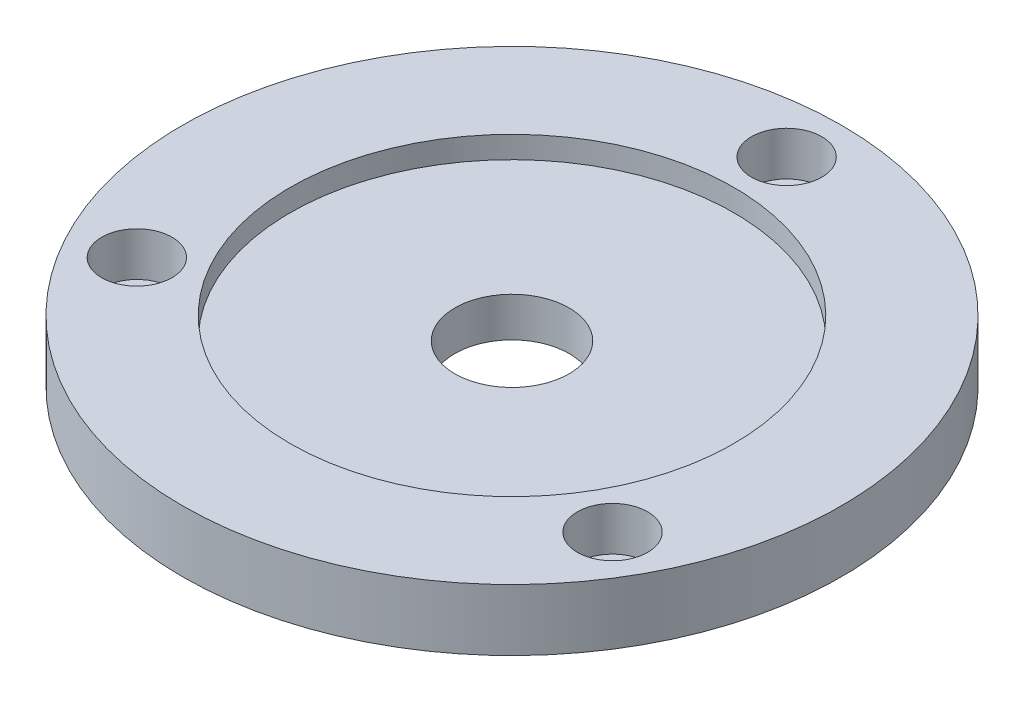
ISO-10303-21;
HEADER;
FILE_DESCRIPTION(('STEP AP214'),'2;1');
FILE_NAME('part.step','',(''),(''),'','','');
FILE_SCHEMA(('AUTOMOTIVE_DESIGN { 1 0 10303 214 1 1 1 1 }'));
ENDSEC;
DATA;
#1=APPLICATION_CONTEXT('core data for automotive mechanical design processes');
#2=APPLICATION_PROTOCOL_DEFINITION('international standard','automotive_design',2000,#1);
#3=PRODUCT_CONTEXT('',#1,'mechanical');
#4=PRODUCT('Part','Part','',(#3));
#5=PRODUCT_RELATED_PRODUCT_CATEGORY('part','',(#4));
#6=PRODUCT_DEFINITION_FORMATION('','',#4);
#7=PRODUCT_DEFINITION_CONTEXT('part definition',#1,'design');
#8=PRODUCT_DEFINITION('design','',#6,#7);
#9=PRODUCT_DEFINITION_SHAPE('','',#8);
#10=(LENGTH_UNIT() NAMED_UNIT(*) SI_UNIT(.MILLI.,.METRE.));
#11=(NAMED_UNIT(*) PLANE_ANGLE_UNIT() SI_UNIT($,.RADIAN.));
#12=(NAMED_UNIT(*) SI_UNIT($,.STERADIAN.) SOLID_ANGLE_UNIT());
#13=UNCERTAINTY_MEASURE_WITH_UNIT(LENGTH_MEASURE(1.E-05),#10,'distance_accuracy_value','');
#14=(GEOMETRIC_REPRESENTATION_CONTEXT(3) GLOBAL_UNCERTAINTY_ASSIGNED_CONTEXT((#13)) GLOBAL_UNIT_ASSIGNED_CONTEXT((#10,
#11,#12)) REPRESENTATION_CONTEXT('',''));
#15=CARTESIAN_POINT('',(0.,0.,0.));
#16=DIRECTION('',(0.,0.,1.));
#17=DIRECTION('',(1.,0.,0.));
#18=AXIS2_PLACEMENT_3D('',#15,#16,#17);
#19=CARTESIAN_POINT('',(54.1265877365273,0.,31.2500000000003));
#20=DIRECTION('',(0.,1.,0.));
#21=DIRECTION('',(0.,0.,1.));
#22=AXIS2_PLACEMENT_3D('',#19,#20,#21);
#23=CYLINDRICAL_SURFACE('',#22,5.);
#24=CARTESIAN_POINT('',(54.1265877365273,0.,31.2500000000003));
#25=DIRECTION('',(0.,1.,0.));
#26=DIRECTION('',(0.,0.,1.));
#27=AXIS2_PLACEMENT_3D('',#24,#25,#26);
#28=CIRCLE('',#27,5.);
#29=CARTESIAN_POINT('',(54.1265877365273,0.,36.2500000000003));
#30=VERTEX_POINT('',#29);
#31=EDGE_CURVE('E88',#30,#30,#28,.T.);
#32=ORIENTED_EDGE('',*,*,#31,.F.);
#33=EDGE_LOOP('',(#32));
#34=FACE_BOUND('',#33,.T.);
#35=CARTESIAN_POINT('',(54.1265877365273,4.,31.2500000000003));
#36=DIRECTION('',(0.,1.,0.));
#37=DIRECTION('',(0.,0.,1.));
#38=AXIS2_PLACEMENT_3D('',#35,#36,#37);
#39=CIRCLE('',#38,5.);
#40=CARTESIAN_POINT('',(54.1265877365273,4.,36.2500000000003));
#41=VERTEX_POINT('',#40);
#42=EDGE_CURVE('E36',#41,#41,#39,.F.);
#43=ORIENTED_EDGE('',*,*,#42,.F.);
#44=EDGE_LOOP('',(#43));
#45=FACE_BOUND('',#44,.T.);
#46=ADVANCED_FACE('F32',(#34,#45),#23,.F.);
#47=CARTESIAN_POINT('',(0.,0.,-62.5));
#48=DIRECTION('',(0.,1.,0.));
#49=DIRECTION('',(0.,0.,1.));
#50=AXIS2_PLACEMENT_3D('',#47,#48,#49);
#51=CYLINDRICAL_SURFACE('',#50,5.);
#52=CARTESIAN_POINT('',(0.,0.,-62.5));
#53=DIRECTION('',(0.,1.,0.));
#54=DIRECTION('',(0.,0.,1.));
#55=AXIS2_PLACEMENT_3D('',#52,#53,#54);
#56=CIRCLE('',#55,5.);
#57=CARTESIAN_POINT('',(0.,0.,-57.5));
#58=VERTEX_POINT('',#57);
#59=EDGE_CURVE('E45',#58,#58,#56,.T.);
#60=ORIENTED_EDGE('',*,*,#59,.F.);
#61=EDGE_LOOP('',(#60));
#62=FACE_BOUND('',#61,.T.);
#63=CARTESIAN_POINT('',(0.,4.,-62.5));
#64=DIRECTION('',(0.,1.,0.));
#65=DIRECTION('',(0.,0.,1.));
#66=AXIS2_PLACEMENT_3D('',#63,#64,#65);
#67=CIRCLE('',#66,5.);
#68=CARTESIAN_POINT('',(0.,4.,-57.5));
#69=VERTEX_POINT('',#68);
#70=EDGE_CURVE('E59',#69,#69,#67,.F.);
#71=ORIENTED_EDGE('',*,*,#70,.F.);
#72=EDGE_LOOP('',(#71));
#73=FACE_BOUND('',#72,.T.);
#74=ADVANCED_FACE('F98',(#62,#73),#51,.F.);
#75=CARTESIAN_POINT('',(-54.1265877365273,0.,31.2500000000003));
#76=DIRECTION('',(0.,1.,0.));
#77=DIRECTION('',(0.,0.,1.));
#78=AXIS2_PLACEMENT_3D('',#75,#76,#77);
#79=CYLINDRICAL_SURFACE('',#78,4.99999999999999);
#80=CARTESIAN_POINT('',(-54.1265877365273,0.,31.2500000000003));
#81=DIRECTION('',(0.,1.,0.));
#82=DIRECTION('',(0.,0.,1.));
#83=AXIS2_PLACEMENT_3D('',#80,#81,#82);
#84=CIRCLE('',#83,4.99999999999999);
#85=CARTESIAN_POINT('',(-54.1265877365273,0.,36.2500000000003));
#86=VERTEX_POINT('',#85);
#87=EDGE_CURVE('E86',#86,#86,#84,.T.);
#88=ORIENTED_EDGE('',*,*,#87,.F.);
#89=EDGE_LOOP('',(#88));
#90=FACE_BOUND('',#89,.T.);
#91=CARTESIAN_POINT('',(-54.1265877365273,4.,31.2500000000003));
#92=DIRECTION('',(0.,1.,0.));
#93=DIRECTION('',(0.,0.,1.));
#94=AXIS2_PLACEMENT_3D('',#91,#92,#93);
#95=CIRCLE('',#94,4.99999999999999);
#96=CARTESIAN_POINT('',(-54.1265877365273,4.,36.2500000000003));
#97=VERTEX_POINT('',#96);
#98=EDGE_CURVE('E55',#97,#97,#95,.F.);
#99=ORIENTED_EDGE('',*,*,#98,.F.);
#100=EDGE_LOOP('',(#99));
#101=FACE_BOUND('',#100,.T.);
#102=ADVANCED_FACE('F101',(#90,#101),#79,.F.);
#103=CARTESIAN_POINT('',(0.,0.,0.));
#104=DIRECTION('',(0.,1.,0.));
#105=DIRECTION('',(0.,0.,1.));
#106=AXIS2_PLACEMENT_3D('',#103,#104,#105);
#107=CYLINDRICAL_SURFACE('',#106,13.);
#108=CARTESIAN_POINT('',(0.,0.,0.));
#109=DIRECTION('',(0.,1.,0.));
#110=DIRECTION('',(0.,0.,1.));
#111=AXIS2_PLACEMENT_3D('',#108,#109,#110);
#112=CIRCLE('',#111,13.);
#113=CARTESIAN_POINT('',(0.,0.,13.));
#114=VERTEX_POINT('',#113);
#115=EDGE_CURVE('E53',#114,#114,#112,.T.);
#116=ORIENTED_EDGE('',*,*,#115,.F.);
#117=EDGE_LOOP('',(#116));
#118=FACE_BOUND('',#117,.T.);
#119=CARTESIAN_POINT('',(0.,9.,0.));
#120=DIRECTION('',(0.,1.,0.));
#121=DIRECTION('',(0.,0.,1.));
#122=AXIS2_PLACEMENT_3D('',#119,#120,#121);
#123=CIRCLE('',#122,13.);
#124=CARTESIAN_POINT('',(0.,9.,13.));
#125=VERTEX_POINT('',#124);
#126=EDGE_CURVE('E50',#125,#125,#123,.F.);
#127=ORIENTED_EDGE('',*,*,#126,.F.);
#128=EDGE_LOOP('',(#127));
#129=FACE_BOUND('',#128,.T.);
#130=ADVANCED_FACE('F107',(#118,#129),#107,.F.);
#131=CARTESIAN_POINT('',(0.,14.,0.));
#132=DIRECTION('',(0.,-1.,0.));
#133=DIRECTION('',(0.,0.,-1.));
#134=AXIS2_PLACEMENT_3D('',#131,#132,#133);
#135=CYLINDRICAL_SURFACE('',#134,75.);
#136=CARTESIAN_POINT('',(0.,14.,0.));
#137=DIRECTION('',(0.,1.,0.));
#138=DIRECTION('',(0.,0.,1.));
#139=AXIS2_PLACEMENT_3D('',#136,#137,#138);
#140=CIRCLE('',#139,75.);
#141=CARTESIAN_POINT('',(0.,14.,75.));
#142=VERTEX_POINT('',#141);
#143=EDGE_CURVE('E10',#142,#142,#140,.T.);
#144=ORIENTED_EDGE('',*,*,#143,.F.);
#145=EDGE_LOOP('',(#144));
#146=FACE_BOUND('',#145,.T.);
#147=CARTESIAN_POINT('',(0.,0.,0.));
#148=DIRECTION('',(0.,1.,0.));
#149=DIRECTION('',(0.,0.,1.));
#150=AXIS2_PLACEMENT_3D('',#147,#148,#149);
#151=CIRCLE('',#150,75.);
#152=CARTESIAN_POINT('',(0.,0.,75.));
#153=VERTEX_POINT('',#152);
#154=EDGE_CURVE('E40',#153,#153,#151,.T.);
#155=ORIENTED_EDGE('',*,*,#154,.T.);
#156=EDGE_LOOP('',(#155));
#157=FACE_BOUND('',#156,.T.);
#158=ADVANCED_FACE('F34',(#146,#157),#135,.T.);
#159=CARTESIAN_POINT('',(0.,14.,0.));
#160=DIRECTION('',(0.,1.,0.));
#161=DIRECTION('',(0.,0.,1.));
#162=AXIS2_PLACEMENT_3D('',#159,#160,#161);
#163=PLANE('',#162);
#164=CARTESIAN_POINT('',(54.1265877365273,14.,31.2500000000003));
#165=DIRECTION('',(0.,1.,0.));
#166=DIRECTION('',(0.,0.,1.));
#167=AXIS2_PLACEMENT_3D('',#164,#165,#166);
#168=CIRCLE('',#167,8.);
#169=CARTESIAN_POINT('',(54.1265877365273,14.,39.2500000000003));
#170=VERTEX_POINT('',#169);
#171=EDGE_CURVE('E75',#170,#170,#168,.T.);
#172=ORIENTED_EDGE('',*,*,#171,.F.);
#173=EDGE_LOOP('',(#172));
#174=FACE_BOUND('',#173,.T.);
#175=CARTESIAN_POINT('',(0.,14.,-62.5));
#176=DIRECTION('',(0.,1.,0.));
#177=DIRECTION('',(0.,0.,1.));
#178=AXIS2_PLACEMENT_3D('',#175,#176,#177);
#179=CIRCLE('',#178,8.);
#180=CARTESIAN_POINT('',(0.,14.,-54.5));
#181=VERTEX_POINT('',#180);
#182=EDGE_CURVE('E68',#181,#181,#179,.T.);
#183=ORIENTED_EDGE('',*,*,#182,.F.);
#184=EDGE_LOOP('',(#183));
#185=FACE_BOUND('',#184,.T.);
#186=CARTESIAN_POINT('',(-54.1265877365273,14.,31.2500000000003));
#187=DIRECTION('',(0.,1.,0.));
#188=DIRECTION('',(0.,0.,1.));
#189=AXIS2_PLACEMENT_3D('',#186,#187,#188);
#190=CIRCLE('',#189,8.);
#191=CARTESIAN_POINT('',(-54.1265877365273,14.,39.2500000000003));
#192=VERTEX_POINT('',#191);
#193=EDGE_CURVE('E61',#192,#192,#190,.T.);
#194=ORIENTED_EDGE('',*,*,#193,.F.);
#195=EDGE_LOOP('',(#194));
#196=FACE_BOUND('',#195,.T.);
#197=CARTESIAN_POINT('',(0.,14.,0.));
#198=DIRECTION('',(0.,1.,0.));
#199=DIRECTION('',(0.,0.,1.));
#200=AXIS2_PLACEMENT_3D('',#197,#198,#199);
#201=CIRCLE('',#200,50.5);
#202=CARTESIAN_POINT('',(0.,14.,50.5));
#203=VERTEX_POINT('',#202);
#204=EDGE_CURVE('E57',#203,#203,#201,.T.);
#205=ORIENTED_EDGE('',*,*,#204,.F.);
#206=EDGE_LOOP('',(#205));
#207=FACE_BOUND('',#206,.T.);
#208=ORIENTED_EDGE('',*,*,#143,.T.);
#209=EDGE_LOOP('',(#208));
#210=FACE_BOUND('',#209,.T.);
#211=ADVANCED_FACE('F113',(#174,#185,#196,#207,#210),#163,.T.);
#212=CARTESIAN_POINT('',(0.,0.,0.));
#213=DIRECTION('',(0.,1.,0.));
#214=DIRECTION('',(0.,0.,1.));
#215=AXIS2_PLACEMENT_3D('',#212,#213,#214);
#216=PLANE('',#215);
#217=ORIENTED_EDGE('',*,*,#115,.T.);
#218=EDGE_LOOP('',(#217));
#219=FACE_BOUND('',#218,.T.);
#220=ORIENTED_EDGE('',*,*,#87,.T.);
#221=EDGE_LOOP('',(#220));
#222=FACE_BOUND('',#221,.T.);
#223=ORIENTED_EDGE('',*,*,#31,.T.);
#224=EDGE_LOOP('',(#223));
#225=FACE_BOUND('',#224,.T.);
#226=ORIENTED_EDGE('',*,*,#59,.T.);
#227=EDGE_LOOP('',(#226));
#228=FACE_BOUND('',#227,.T.);
#229=ORIENTED_EDGE('',*,*,#154,.F.);
#230=EDGE_LOOP('',(#229));
#231=FACE_BOUND('',#230,.T.);
#232=ADVANCED_FACE('F95',(#219,#222,#225,#228,#231),#216,.F.);
#233=CARTESIAN_POINT('',(0.,9.,0.));
#234=DIRECTION('',(0.,1.,0.));
#235=DIRECTION('',(0.,0.,1.));
#236=AXIS2_PLACEMENT_3D('',#233,#234,#235);
#237=PLANE('',#236);
#238=CARTESIAN_POINT('',(0.,9.,0.));
#239=DIRECTION('',(0.,1.,0.));
#240=DIRECTION('',(0.,0.,1.));
#241=AXIS2_PLACEMENT_3D('',#238,#239,#240);
#242=CIRCLE('',#241,50.5);
#243=CARTESIAN_POINT('',(0.,9.,50.5));
#244=VERTEX_POINT('',#243);
#245=EDGE_CURVE('E54',#244,#244,#242,.T.);
#246=ORIENTED_EDGE('',*,*,#245,.T.);
#247=EDGE_LOOP('',(#246));
#248=FACE_BOUND('',#247,.T.);
#249=ORIENTED_EDGE('',*,*,#126,.T.);
#250=EDGE_LOOP('',(#249));
#251=FACE_BOUND('',#250,.T.);
#252=ADVANCED_FACE('F117',(#248,#251),#237,.T.);
#253=CARTESIAN_POINT('',(0.,9.,0.));
#254=DIRECTION('',(0.,1.,0.));
#255=DIRECTION('',(0.,0.,1.));
#256=AXIS2_PLACEMENT_3D('',#253,#254,#255);
#257=CYLINDRICAL_SURFACE('',#256,50.5);
#258=ORIENTED_EDGE('',*,*,#245,.F.);
#259=EDGE_LOOP('',(#258));
#260=FACE_BOUND('',#259,.T.);
#261=ORIENTED_EDGE('',*,*,#204,.T.);
#262=EDGE_LOOP('',(#261));
#263=FACE_BOUND('',#262,.T.);
#264=ADVANCED_FACE('F122',(#260,#263),#257,.F.);
#265=CARTESIAN_POINT('',(-54.1265877365273,4.,31.2500000000003));
#266=DIRECTION('',(0.,1.,0.));
#267=DIRECTION('',(0.,0.,1.));
#268=AXIS2_PLACEMENT_3D('',#265,#266,#267);
#269=PLANE('',#268);
#270=CARTESIAN_POINT('',(-54.1265877365273,4.,31.2500000000003));
#271=DIRECTION('',(0.,1.,0.));
#272=DIRECTION('',(0.,0.,1.));
#273=AXIS2_PLACEMENT_3D('',#270,#271,#272);
#274=CIRCLE('',#273,8.);
#275=CARTESIAN_POINT('',(-54.1265877365273,4.,39.2500000000003));
#276=VERTEX_POINT('',#275);
#277=EDGE_CURVE('E58',#276,#276,#274,.T.);
#278=ORIENTED_EDGE('',*,*,#277,.T.);
#279=EDGE_LOOP('',(#278));
#280=FACE_BOUND('',#279,.T.);
#281=ORIENTED_EDGE('',*,*,#98,.T.);
#282=EDGE_LOOP('',(#281));
#283=FACE_BOUND('',#282,.T.);
#284=ADVANCED_FACE('F131',(#280,#283),#269,.T.);
#285=CARTESIAN_POINT('',(-54.1265877365273,4.,31.2500000000003));
#286=DIRECTION('',(0.,1.,0.));
#287=DIRECTION('',(0.,0.,1.));
#288=AXIS2_PLACEMENT_3D('',#285,#286,#287);
#289=CYLINDRICAL_SURFACE('',#288,8.);
#290=ORIENTED_EDGE('',*,*,#277,.F.);
#291=EDGE_LOOP('',(#290));
#292=FACE_BOUND('',#291,.T.);
#293=ORIENTED_EDGE('',*,*,#193,.T.);
#294=EDGE_LOOP('',(#293));
#295=FACE_BOUND('',#294,.T.);
#296=ADVANCED_FACE('F133',(#292,#295),#289,.F.);
#297=CARTESIAN_POINT('',(0.,4.,-62.5));
#298=DIRECTION('',(0.,1.,0.));
#299=DIRECTION('',(0.,0.,1.));
#300=AXIS2_PLACEMENT_3D('',#297,#298,#299);
#301=PLANE('',#300);
#302=CARTESIAN_POINT('',(0.,4.,-62.5));
#303=DIRECTION('',(0.,1.,0.));
#304=DIRECTION('',(0.,0.,1.));
#305=AXIS2_PLACEMENT_3D('',#302,#303,#304);
#306=CIRCLE('',#305,8.);
#307=CARTESIAN_POINT('',(0.,4.,-54.5));
#308=VERTEX_POINT('',#307);
#309=EDGE_CURVE('E62',#308,#308,#306,.T.);
#310=ORIENTED_EDGE('',*,*,#309,.T.);
#311=EDGE_LOOP('',(#310));
#312=FACE_BOUND('',#311,.T.);
#313=ORIENTED_EDGE('',*,*,#70,.T.);
#314=EDGE_LOOP('',(#313));
#315=FACE_BOUND('',#314,.T.);
#316=ADVANCED_FACE('F140',(#312,#315),#301,.T.);
#317=CARTESIAN_POINT('',(0.,4.,-62.5));
#318=DIRECTION('',(0.,1.,0.));
#319=DIRECTION('',(0.,0.,1.));
#320=AXIS2_PLACEMENT_3D('',#317,#318,#319);
#321=CYLINDRICAL_SURFACE('',#320,8.);
#322=ORIENTED_EDGE('',*,*,#309,.F.);
#323=EDGE_LOOP('',(#322));
#324=FACE_BOUND('',#323,.T.);
#325=ORIENTED_EDGE('',*,*,#182,.T.);
#326=EDGE_LOOP('',(#325));
#327=FACE_BOUND('',#326,.T.);
#328=ADVANCED_FACE('F146',(#324,#327),#321,.F.);
#329=CARTESIAN_POINT('',(54.1265877365273,4.,31.2500000000003));
#330=DIRECTION('',(0.,1.,0.));
#331=DIRECTION('',(0.,0.,1.));
#332=AXIS2_PLACEMENT_3D('',#329,#330,#331);
#333=PLANE('',#332);
#334=CARTESIAN_POINT('',(54.1265877365273,4.,31.2500000000003));
#335=DIRECTION('',(0.,1.,0.));
#336=DIRECTION('',(0.,0.,1.));
#337=AXIS2_PLACEMENT_3D('',#334,#335,#336);
#338=CIRCLE('',#337,8.);
#339=CARTESIAN_POINT('',(54.1265877365273,4.,39.2500000000003));
#340=VERTEX_POINT('',#339);
#341=EDGE_CURVE('E225',#340,#340,#338,.T.);
#342=ORIENTED_EDGE('',*,*,#341,.T.);
#343=EDGE_LOOP('',(#342));
#344=FACE_BOUND('',#343,.T.);
#345=ORIENTED_EDGE('',*,*,#42,.T.);
#346=EDGE_LOOP('',(#345));
#347=FACE_BOUND('',#346,.T.);
#348=ADVANCED_FACE('F199',(#344,#347),#333,.T.);
#349=CARTESIAN_POINT('',(54.1265877365273,4.,31.2500000000003));
#350=DIRECTION('',(0.,1.,0.));
#351=DIRECTION('',(0.,0.,1.));
#352=AXIS2_PLACEMENT_3D('',#349,#350,#351);
#353=CYLINDRICAL_SURFACE('',#352,8.);
#354=ORIENTED_EDGE('',*,*,#341,.F.);
#355=EDGE_LOOP('',(#354));
#356=FACE_BOUND('',#355,.T.);
#357=ORIENTED_EDGE('',*,*,#171,.T.);
#358=EDGE_LOOP('',(#357));
#359=FACE_BOUND('',#358,.T.);
#360=ADVANCED_FACE('F208',(#356,#359),#353,.F.);
#361=CLOSED_SHELL('',(#46,#74,#102,#130,#158,#211,#232,#252,#264,#284,#296,#316,#328,#348,#360));
#362=MANIFOLD_SOLID_BREP('B2',#361);
#363=ADVANCED_BREP_SHAPE_REPRESENTATION('',(#18,#362),#14);
#364=SHAPE_DEFINITION_REPRESENTATION(#9,#363);
ENDSEC;
END-ISO-10303-21;
